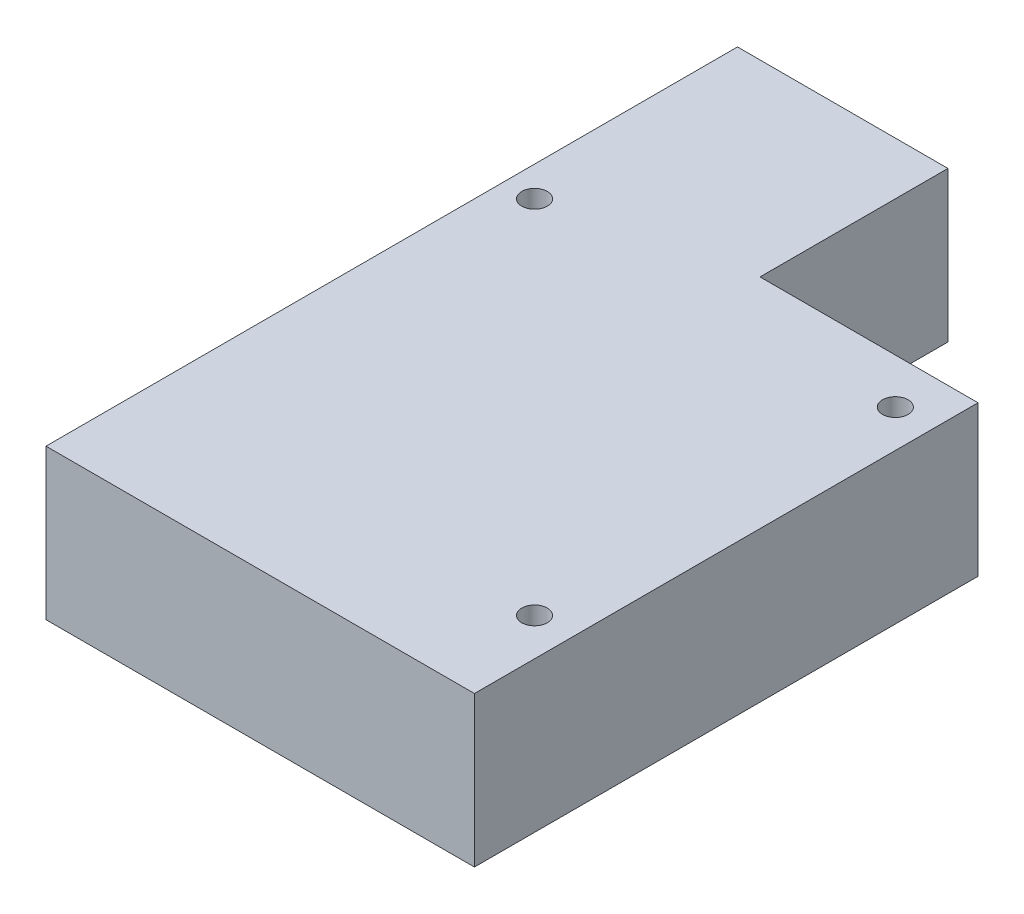
ISO-10303-21;
HEADER;
FILE_DESCRIPTION(('STEP AP214'),'2;1');
FILE_NAME('part.step','',(''),(''),'','','');
FILE_SCHEMA(('AUTOMOTIVE_DESIGN { 1 0 10303 214 1 1 1 1 }'));
ENDSEC;
DATA;
#1=APPLICATION_CONTEXT('core data for automotive mechanical design processes');
#2=APPLICATION_PROTOCOL_DEFINITION('international standard','automotive_design',2000,#1);
#3=PRODUCT_CONTEXT('',#1,'mechanical');
#4=PRODUCT('Part','Part','',(#3));
#5=PRODUCT_RELATED_PRODUCT_CATEGORY('part','',(#4));
#6=PRODUCT_DEFINITION_FORMATION('','',#4);
#7=PRODUCT_DEFINITION_CONTEXT('part definition',#1,'design');
#8=PRODUCT_DEFINITION('design','',#6,#7);
#9=PRODUCT_DEFINITION_SHAPE('','',#8);
#10=(LENGTH_UNIT() NAMED_UNIT(*) SI_UNIT(.MILLI.,.METRE.));
#11=(NAMED_UNIT(*) PLANE_ANGLE_UNIT() SI_UNIT($,.RADIAN.));
#12=(NAMED_UNIT(*) SI_UNIT($,.STERADIAN.) SOLID_ANGLE_UNIT());
#13=UNCERTAINTY_MEASURE_WITH_UNIT(LENGTH_MEASURE(1.E-05),#10,'distance_accuracy_value','');
#14=(GEOMETRIC_REPRESENTATION_CONTEXT(3) GLOBAL_UNCERTAINTY_ASSIGNED_CONTEXT((#13)) GLOBAL_UNIT_ASSIGNED_CONTEXT((#10,
#11,#12)) REPRESENTATION_CONTEXT('',''));
#15=CARTESIAN_POINT('',(0.,0.,0.));
#16=DIRECTION('',(0.,0.,1.));
#17=DIRECTION('',(1.,0.,0.));
#18=AXIS2_PLACEMENT_3D('',#15,#16,#17);
#19=CARTESIAN_POINT('',(-28.5,20.,-33.5));
#20=DIRECTION('',(0.,0.,1.));
#21=DIRECTION('',(1.,0.,0.));
#22=AXIS2_PLACEMENT_3D('',#19,#20,#21);
#23=PLANE('',#22);
#24=DIRECTION('',(0.,-1.,0.));
#25=VECTOR('',#24,1.);
#26=CARTESIAN_POINT('',(-0.499999999999993,20.,-33.5));
#27=LINE('',#26,#25);
#28=CARTESIAN_POINT('',(-0.5,20.,-33.5));
#29=VERTEX_POINT('',#28);
#30=CARTESIAN_POINT('',(-0.499999999999997,0.,-33.5));
#31=VERTEX_POINT('',#30);
#32=EDGE_CURVE('E55',#29,#31,#27,.T.);
#33=ORIENTED_EDGE('',*,*,#32,.F.);
#34=DIRECTION('',(-1.,0.,0.));
#35=VECTOR('',#34,1.);
#36=CARTESIAN_POINT('',(-28.5,20.,-33.5));
#37=LINE('',#36,#35);
#38=CARTESIAN_POINT('',(28.5,20.,-33.5));
#39=VERTEX_POINT('',#38);
#40=EDGE_CURVE('E83',#39,#29,#37,.T.);
#41=ORIENTED_EDGE('',*,*,#40,.F.);
#42=DIRECTION('',(0.,-1.,0.));
#43=VECTOR('',#42,1.);
#44=CARTESIAN_POINT('',(28.5,20.,-33.5));
#45=LINE('',#44,#43);
#46=CARTESIAN_POINT('',(28.5,0.,-33.5));
#47=VERTEX_POINT('',#46);
#48=EDGE_CURVE('E11',#39,#47,#45,.T.);
#49=ORIENTED_EDGE('',*,*,#48,.T.);
#50=DIRECTION('',(-1.,0.,0.));
#51=VECTOR('',#50,1.);
#52=CARTESIAN_POINT('',(-28.5,0.,-33.5));
#53=LINE('',#52,#51);
#54=EDGE_CURVE('E172',#47,#31,#53,.T.);
#55=ORIENTED_EDGE('',*,*,#54,.T.);
#56=EDGE_LOOP('',(#33,#41,#49,#55));
#57=FACE_BOUND('',#56,.T.);
#58=ADVANCED_FACE('F39',(#57),#23,.F.);
#59=CARTESIAN_POINT('',(28.5,20.,33.5));
#60=DIRECTION('',(-1.,0.,0.));
#61=DIRECTION('',(0.,0.,1.));
#62=AXIS2_PLACEMENT_3D('',#59,#60,#61);
#63=PLANE('',#62);
#64=DIRECTION('',(0.,0.,-1.));
#65=VECTOR('',#64,1.);
#66=CARTESIAN_POINT('',(28.5,0.,33.5));
#67=LINE('',#66,#65);
#68=CARTESIAN_POINT('',(28.5,0.,33.5));
#69=VERTEX_POINT('',#68);
#70=EDGE_CURVE('E141',#69,#47,#67,.T.);
#71=ORIENTED_EDGE('',*,*,#70,.T.);
#72=ORIENTED_EDGE('',*,*,#48,.F.);
#73=DIRECTION('',(0.,0.,-1.));
#74=VECTOR('',#73,1.);
#75=CARTESIAN_POINT('',(28.5,20.,33.5));
#76=LINE('',#75,#74);
#77=CARTESIAN_POINT('',(28.5,20.,33.5));
#78=VERTEX_POINT('',#77);
#79=EDGE_CURVE('E161',#78,#39,#76,.T.);
#80=ORIENTED_EDGE('',*,*,#79,.F.);
#81=DIRECTION('',(0.,-1.,0.));
#82=VECTOR('',#81,1.);
#83=CARTESIAN_POINT('',(28.5,20.,33.5));
#84=LINE('',#83,#82);
#85=EDGE_CURVE('E168',#78,#69,#84,.T.);
#86=ORIENTED_EDGE('',*,*,#85,.T.);
#87=EDGE_LOOP('',(#71,#72,#80,#86));
#88=FACE_BOUND('',#87,.T.);
#89=ADVANCED_FACE('F41',(#88),#63,.F.);
#90=CARTESIAN_POINT('',(-28.5,20.,33.5));
#91=DIRECTION('',(1.,0.,0.));
#92=DIRECTION('',(0.,0.,-1.));
#93=AXIS2_PLACEMENT_3D('',#90,#91,#92);
#94=PLANE('',#93);
#95=DIRECTION('',(0.,0.,1.));
#96=VECTOR('',#95,1.);
#97=CARTESIAN_POINT('',(-28.5,0.,33.5));
#98=LINE('',#97,#96);
#99=CARTESIAN_POINT('',(-28.5,0.,-58.5));
#100=VERTEX_POINT('',#99);
#101=CARTESIAN_POINT('',(-28.5,0.,33.5));
#102=VERTEX_POINT('',#101);
#103=EDGE_CURVE('E175',#100,#102,#98,.T.);
#104=ORIENTED_EDGE('',*,*,#103,.T.);
#105=DIRECTION('',(0.,-1.,0.));
#106=VECTOR('',#105,1.);
#107=CARTESIAN_POINT('',(-28.5,20.,33.5));
#108=LINE('',#107,#106);
#109=CARTESIAN_POINT('',(-28.5,20.,33.5));
#110=VERTEX_POINT('',#109);
#111=EDGE_CURVE('E48',#110,#102,#108,.T.);
#112=ORIENTED_EDGE('',*,*,#111,.F.);
#113=DIRECTION('',(0.,0.,1.));
#114=VECTOR('',#113,1.);
#115=CARTESIAN_POINT('',(-28.5,20.,33.5));
#116=LINE('',#115,#114);
#117=CARTESIAN_POINT('',(-28.5,20.,-58.5));
#118=VERTEX_POINT('',#117);
#119=EDGE_CURVE('E100',#118,#110,#116,.T.);
#120=ORIENTED_EDGE('',*,*,#119,.F.);
#121=DIRECTION('',(0.,1.,0.));
#122=VECTOR('',#121,1.);
#123=CARTESIAN_POINT('',(-28.5,20.,-58.5));
#124=LINE('',#123,#122);
#125=EDGE_CURVE('E104',#100,#118,#124,.T.);
#126=ORIENTED_EDGE('',*,*,#125,.F.);
#127=EDGE_LOOP('',(#104,#112,#120,#126));
#128=FACE_BOUND('',#127,.T.);
#129=ADVANCED_FACE('F102',(#128),#94,.F.);
#130=CARTESIAN_POINT('',(-28.5,20.,33.5));
#131=DIRECTION('',(0.,0.,-1.));
#132=DIRECTION('',(-1.,0.,0.));
#133=AXIS2_PLACEMENT_3D('',#130,#131,#132);
#134=PLANE('',#133);
#135=DIRECTION('',(1.,0.,0.));
#136=VECTOR('',#135,1.);
#137=CARTESIAN_POINT('',(-28.5,0.,33.5));
#138=LINE('',#137,#136);
#139=EDGE_CURVE('E81',#102,#69,#138,.T.);
#140=ORIENTED_EDGE('',*,*,#139,.T.);
#141=ORIENTED_EDGE('',*,*,#85,.F.);
#142=DIRECTION('',(1.,0.,0.));
#143=VECTOR('',#142,1.);
#144=CARTESIAN_POINT('',(-28.5,20.,33.5));
#145=LINE('',#144,#143);
#146=EDGE_CURVE('E64',#110,#78,#145,.T.);
#147=ORIENTED_EDGE('',*,*,#146,.F.);
#148=ORIENTED_EDGE('',*,*,#111,.T.);
#149=EDGE_LOOP('',(#140,#141,#147,#148));
#150=FACE_BOUND('',#149,.T.);
#151=ADVANCED_FACE('F182',(#150),#134,.F.);
#152=CARTESIAN_POINT('',(0.,20.,0.));
#153=DIRECTION('',(0.,-1.,0.));
#154=DIRECTION('',(0.,0.,-1.));
#155=AXIS2_PLACEMENT_3D('',#152,#153,#154);
#156=PLANE('',#155);
#157=CARTESIAN_POINT('',(-24.5,20.,-27.5));
#158=DIRECTION('',(0.,1.,0.));
#159=DIRECTION('',(0.,0.,1.));
#160=AXIS2_PLACEMENT_3D('',#157,#158,#159);
#161=CIRCLE('',#160,1.7);
#162=CARTESIAN_POINT('',(-24.5,20.,-25.8));
#163=VERTEX_POINT('',#162);
#164=EDGE_CURVE('E142',#163,#163,#161,.T.);
#165=ORIENTED_EDGE('',*,*,#164,.F.);
#166=EDGE_LOOP('',(#165));
#167=FACE_BOUND('',#166,.T.);
#168=CARTESIAN_POINT('',(23.5,20.,-27.5));
#169=DIRECTION('',(0.,1.,0.));
#170=DIRECTION('',(0.,0.,1.));
#171=AXIS2_PLACEMENT_3D('',#168,#169,#170);
#172=CIRCLE('',#171,1.7);
#173=CARTESIAN_POINT('',(23.5,20.,-25.8));
#174=VERTEX_POINT('',#173);
#175=EDGE_CURVE('E150',#174,#174,#172,.T.);
#176=ORIENTED_EDGE('',*,*,#175,.F.);
#177=EDGE_LOOP('',(#176));
#178=FACE_BOUND('',#177,.T.);
#179=CARTESIAN_POINT('',(23.5,20.,20.5));
#180=DIRECTION('',(0.,1.,0.));
#181=DIRECTION('',(0.,0.,1.));
#182=AXIS2_PLACEMENT_3D('',#179,#180,#181);
#183=CIRCLE('',#182,1.7);
#184=CARTESIAN_POINT('',(23.5,20.,22.2));
#185=VERTEX_POINT('',#184);
#186=EDGE_CURVE('E136',#185,#185,#183,.T.);
#187=ORIENTED_EDGE('',*,*,#186,.F.);
#188=EDGE_LOOP('',(#187));
#189=FACE_BOUND('',#188,.T.);
#190=ORIENTED_EDGE('',*,*,#79,.T.);
#191=ORIENTED_EDGE('',*,*,#40,.T.);
#192=DIRECTION('',(0.,0.,1.));
#193=VECTOR('',#192,1.);
#194=CARTESIAN_POINT('',(-0.499999999999993,20.,-58.5));
#195=LINE('',#194,#193);
#196=CARTESIAN_POINT('',(-0.499999999999993,20.,-58.5));
#197=VERTEX_POINT('',#196);
#198=EDGE_CURVE('E111',#197,#29,#195,.T.);
#199=ORIENTED_EDGE('',*,*,#198,.F.);
#200=DIRECTION('',(1.,0.,0.));
#201=VECTOR('',#200,1.);
#202=CARTESIAN_POINT('',(-28.5,20.,-58.5));
#203=LINE('',#202,#201);
#204=EDGE_CURVE('E108',#118,#197,#203,.T.);
#205=ORIENTED_EDGE('',*,*,#204,.F.);
#206=ORIENTED_EDGE('',*,*,#119,.T.);
#207=ORIENTED_EDGE('',*,*,#146,.T.);
#208=EDGE_LOOP('',(#190,#191,#199,#205,#206,#207));
#209=FACE_BOUND('',#208,.T.);
#210=ADVANCED_FACE('F109',(#167,#178,#189,#209),#156,.F.);
#211=CARTESIAN_POINT('',(0.,0.,0.));
#212=DIRECTION('',(0.,-1.,0.));
#213=DIRECTION('',(0.,0.,-1.));
#214=AXIS2_PLACEMENT_3D('',#211,#212,#213);
#215=PLANE('',#214);
#216=CARTESIAN_POINT('',(-24.5,0.,-27.5));
#217=DIRECTION('',(0.,1.,0.));
#218=DIRECTION('',(0.,0.,1.));
#219=AXIS2_PLACEMENT_3D('',#216,#217,#218);
#220=CIRCLE('',#219,1.7);
#221=CARTESIAN_POINT('',(-24.5,0.,-25.8));
#222=VERTEX_POINT('',#221);
#223=EDGE_CURVE('E137',#222,#222,#220,.T.);
#224=ORIENTED_EDGE('',*,*,#223,.T.);
#225=EDGE_LOOP('',(#224));
#226=FACE_BOUND('',#225,.T.);
#227=CARTESIAN_POINT('',(23.5,0.,-27.5));
#228=DIRECTION('',(0.,1.,0.));
#229=DIRECTION('',(0.,0.,1.));
#230=AXIS2_PLACEMENT_3D('',#227,#228,#229);
#231=CIRCLE('',#230,1.7);
#232=CARTESIAN_POINT('',(23.5,0.,-25.8));
#233=VERTEX_POINT('',#232);
#234=EDGE_CURVE('E146',#233,#233,#231,.T.);
#235=ORIENTED_EDGE('',*,*,#234,.T.);
#236=EDGE_LOOP('',(#235));
#237=FACE_BOUND('',#236,.T.);
#238=CARTESIAN_POINT('',(23.5,0.,20.5));
#239=DIRECTION('',(0.,1.,0.));
#240=DIRECTION('',(0.,0.,1.));
#241=AXIS2_PLACEMENT_3D('',#238,#239,#240);
#242=CIRCLE('',#241,1.7);
#243=CARTESIAN_POINT('',(23.5,0.,22.2));
#244=VERTEX_POINT('',#243);
#245=EDGE_CURVE('E154',#244,#244,#242,.T.);
#246=ORIENTED_EDGE('',*,*,#245,.T.);
#247=EDGE_LOOP('',(#246));
#248=FACE_BOUND('',#247,.T.);
#249=ORIENTED_EDGE('',*,*,#70,.F.);
#250=ORIENTED_EDGE('',*,*,#139,.F.);
#251=ORIENTED_EDGE('',*,*,#103,.F.);
#252=DIRECTION('',(-1.,0.,0.));
#253=VECTOR('',#252,1.);
#254=CARTESIAN_POINT('',(-28.5,0.,-58.5));
#255=LINE('',#254,#253);
#256=CARTESIAN_POINT('',(-0.499999999999997,0.,-58.5));
#257=VERTEX_POINT('',#256);
#258=EDGE_CURVE('E120',#257,#100,#255,.T.);
#259=ORIENTED_EDGE('',*,*,#258,.F.);
#260=DIRECTION('',(0.,0.,1.));
#261=VECTOR('',#260,1.);
#262=CARTESIAN_POINT('',(-0.499999999999997,0.,-58.5));
#263=LINE('',#262,#261);
#264=EDGE_CURVE('E129',#257,#31,#263,.T.);
#265=ORIENTED_EDGE('',*,*,#264,.T.);
#266=ORIENTED_EDGE('',*,*,#54,.F.);
#267=EDGE_LOOP('',(#249,#250,#251,#259,#265,#266));
#268=FACE_BOUND('',#267,.T.);
#269=ADVANCED_FACE('F185',(#226,#237,#248,#268),#215,.T.);
#270=CARTESIAN_POINT('',(23.5,0.,20.5));
#271=DIRECTION('',(0.,1.,0.));
#272=DIRECTION('',(0.,0.,1.));
#273=AXIS2_PLACEMENT_3D('',#270,#271,#272);
#274=CYLINDRICAL_SURFACE('',#273,1.7);
#275=ORIENTED_EDGE('',*,*,#245,.F.);
#276=EDGE_LOOP('',(#275));
#277=FACE_BOUND('',#276,.T.);
#278=ORIENTED_EDGE('',*,*,#186,.T.);
#279=EDGE_LOOP('',(#278));
#280=FACE_BOUND('',#279,.T.);
#281=ADVANCED_FACE('F216',(#277,#280),#274,.F.);
#282=CARTESIAN_POINT('',(23.5,0.,-27.5));
#283=DIRECTION('',(0.,1.,0.));
#284=DIRECTION('',(0.,0.,1.));
#285=AXIS2_PLACEMENT_3D('',#282,#283,#284);
#286=CYLINDRICAL_SURFACE('',#285,1.7);
#287=ORIENTED_EDGE('',*,*,#234,.F.);
#288=EDGE_LOOP('',(#287));
#289=FACE_BOUND('',#288,.T.);
#290=ORIENTED_EDGE('',*,*,#175,.T.);
#291=EDGE_LOOP('',(#290));
#292=FACE_BOUND('',#291,.T.);
#293=ADVANCED_FACE('F201',(#289,#292),#286,.F.);
#294=CARTESIAN_POINT('',(-24.5,0.,-27.5));
#295=DIRECTION('',(0.,1.,0.));
#296=DIRECTION('',(0.,0.,1.));
#297=AXIS2_PLACEMENT_3D('',#294,#295,#296);
#298=CYLINDRICAL_SURFACE('',#297,1.7);
#299=ORIENTED_EDGE('',*,*,#223,.F.);
#300=EDGE_LOOP('',(#299));
#301=FACE_BOUND('',#300,.T.);
#302=ORIENTED_EDGE('',*,*,#164,.T.);
#303=EDGE_LOOP('',(#302));
#304=FACE_BOUND('',#303,.T.);
#305=ADVANCED_FACE('F193',(#301,#304),#298,.F.);
#306=CARTESIAN_POINT('',(-0.499999999999993,20.,-58.5));
#307=DIRECTION('',(-1.,0.,0.));
#308=DIRECTION('',(0.,-1.,0.));
#309=AXIS2_PLACEMENT_3D('',#306,#307,#308);
#310=PLANE('',#309);
#311=ORIENTED_EDGE('',*,*,#32,.T.);
#312=ORIENTED_EDGE('',*,*,#264,.F.);
#313=DIRECTION('',(0.,-1.,0.));
#314=VECTOR('',#313,1.);
#315=CARTESIAN_POINT('',(-0.499999999999993,20.,-58.5));
#316=LINE('',#315,#314);
#317=EDGE_CURVE('E115',#197,#257,#316,.T.);
#318=ORIENTED_EDGE('',*,*,#317,.F.);
#319=ORIENTED_EDGE('',*,*,#198,.T.);
#320=EDGE_LOOP('',(#311,#312,#318,#319));
#321=FACE_BOUND('',#320,.T.);
#322=ADVANCED_FACE('F190',(#321),#310,.F.);
#323=CARTESIAN_POINT('',(0.,0.,-58.5));
#324=DIRECTION('',(0.,0.,1.));
#325=DIRECTION('',(1.,0.,0.));
#326=AXIS2_PLACEMENT_3D('',#323,#324,#325);
#327=PLANE('',#326);
#328=ORIENTED_EDGE('',*,*,#125,.T.);
#329=ORIENTED_EDGE('',*,*,#204,.T.);
#330=ORIENTED_EDGE('',*,*,#317,.T.);
#331=ORIENTED_EDGE('',*,*,#258,.T.);
#332=EDGE_LOOP('',(#328,#329,#330,#331));
#333=FACE_BOUND('',#332,.T.);
#334=ADVANCED_FACE('F118',(#333),#327,.F.);
#335=CLOSED_SHELL('',(#58,#89,#129,#151,#210,#269,#281,#293,#305,#322,#334));
#336=MANIFOLD_SOLID_BREP('B2',#335);
#337=ADVANCED_BREP_SHAPE_REPRESENTATION('',(#18,#336),#14);
#338=SHAPE_DEFINITION_REPRESENTATION(#9,#337);
ENDSEC;
END-ISO-10303-21;
